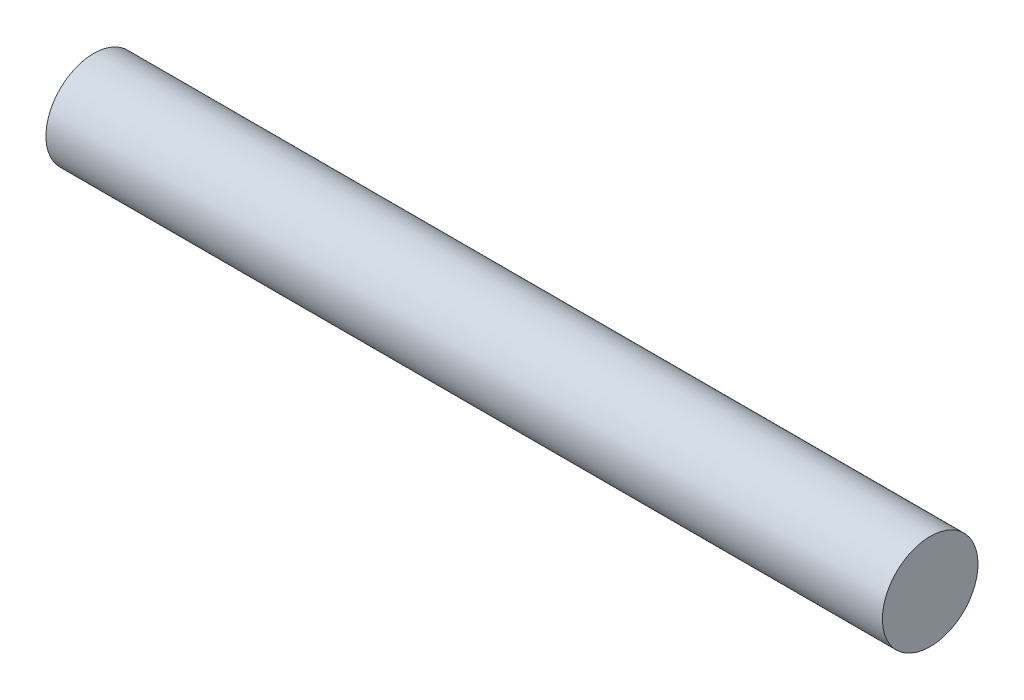
ISO-10303-21;
HEADER;
FILE_DESCRIPTION(('STEP AP214'),'2;1');
FILE_NAME('part.step','',(''),(''),'','','');
FILE_SCHEMA(('AUTOMOTIVE_DESIGN { 1 0 10303 214 1 1 1 1 }'));
ENDSEC;
DATA;
#1=APPLICATION_CONTEXT('core data for automotive mechanical design processes');
#2=APPLICATION_PROTOCOL_DEFINITION('international standard','automotive_design',2000,#1);
#3=PRODUCT_CONTEXT('',#1,'mechanical');
#4=PRODUCT('Part','Part','',(#3));
#5=PRODUCT_RELATED_PRODUCT_CATEGORY('part','',(#4));
#6=PRODUCT_DEFINITION_FORMATION('','',#4);
#7=PRODUCT_DEFINITION_CONTEXT('part definition',#1,'design');
#8=PRODUCT_DEFINITION('design','',#6,#7);
#9=PRODUCT_DEFINITION_SHAPE('','',#8);
#10=(LENGTH_UNIT() NAMED_UNIT(*) SI_UNIT(.MILLI.,.METRE.));
#11=(NAMED_UNIT(*) PLANE_ANGLE_UNIT() SI_UNIT($,.RADIAN.));
#12=(NAMED_UNIT(*) SI_UNIT($,.STERADIAN.) SOLID_ANGLE_UNIT());
#13=UNCERTAINTY_MEASURE_WITH_UNIT(LENGTH_MEASURE(1.E-05),#10,'distance_accuracy_value','');
#14=(GEOMETRIC_REPRESENTATION_CONTEXT(3) GLOBAL_UNCERTAINTY_ASSIGNED_CONTEXT((#13)) GLOBAL_UNIT_ASSIGNED_CONTEXT((#10,
#11,#12)) REPRESENTATION_CONTEXT('',''));
#15=CARTESIAN_POINT('',(0.,0.,0.));
#16=DIRECTION('',(0.,0.,1.));
#17=DIRECTION('',(1.,0.,0.));
#18=AXIS2_PLACEMENT_3D('',#15,#16,#17);
#19=CARTESIAN_POINT('',(70.,0.,0.));
#20=DIRECTION('',(-1.,0.,0.));
#21=DIRECTION('',(0.,0.,1.));
#22=AXIS2_PLACEMENT_3D('',#19,#20,#21);
#23=CYLINDRICAL_SURFACE('',#22,4.);
#24=CARTESIAN_POINT('',(70.,0.,0.));
#25=DIRECTION('',(1.,0.,0.));
#26=DIRECTION('',(0.,0.,-1.));
#27=AXIS2_PLACEMENT_3D('',#24,#25,#26);
#28=CIRCLE('',#27,4.);
#29=CARTESIAN_POINT('',(70.,0.,-4.));
#30=VERTEX_POINT('',#29);
#31=EDGE_CURVE('E10',#30,#30,#28,.T.);
#32=ORIENTED_EDGE('',*,*,#31,.F.);
#33=EDGE_LOOP('',(#32));
#34=FACE_BOUND('',#33,.T.);
#35=CARTESIAN_POINT('',(0.,0.,0.));
#36=DIRECTION('',(1.,0.,0.));
#37=DIRECTION('',(0.,0.,-1.));
#38=AXIS2_PLACEMENT_3D('',#35,#36,#37);
#39=CIRCLE('',#38,4.);
#40=CARTESIAN_POINT('',(0.,0.,-4.));
#41=VERTEX_POINT('',#40);
#42=EDGE_CURVE('E35',#41,#41,#39,.T.);
#43=ORIENTED_EDGE('',*,*,#42,.T.);
#44=EDGE_LOOP('',(#43));
#45=FACE_BOUND('',#44,.T.);
#46=ADVANCED_FACE('F32',(#34,#45),#23,.T.);
#47=CARTESIAN_POINT('',(70.,0.,0.));
#48=DIRECTION('',(1.,0.,0.));
#49=DIRECTION('',(0.,0.,-1.));
#50=AXIS2_PLACEMENT_3D('',#47,#48,#49);
#51=PLANE('',#50);
#52=ORIENTED_EDGE('',*,*,#31,.T.);
#53=EDGE_LOOP('',(#52));
#54=FACE_BOUND('',#53,.T.);
#55=ADVANCED_FACE('F47',(#54),#51,.T.);
#56=CARTESIAN_POINT('',(0.,0.,0.));
#57=DIRECTION('',(1.,0.,0.));
#58=DIRECTION('',(0.,0.,-1.));
#59=AXIS2_PLACEMENT_3D('',#56,#57,#58);
#60=PLANE('',#59);
#61=ORIENTED_EDGE('',*,*,#42,.F.);
#62=EDGE_LOOP('',(#61));
#63=FACE_BOUND('',#62,.T.);
#64=ADVANCED_FACE('F45',(#63),#60,.F.);
#65=CLOSED_SHELL('',(#46,#55,#64));
#66=MANIFOLD_SOLID_BREP('B2',#65);
#67=ADVANCED_BREP_SHAPE_REPRESENTATION('',(#18,#66),#14);
#68=SHAPE_DEFINITION_REPRESENTATION(#9,#67);
ENDSEC;
END-ISO-10303-21;
